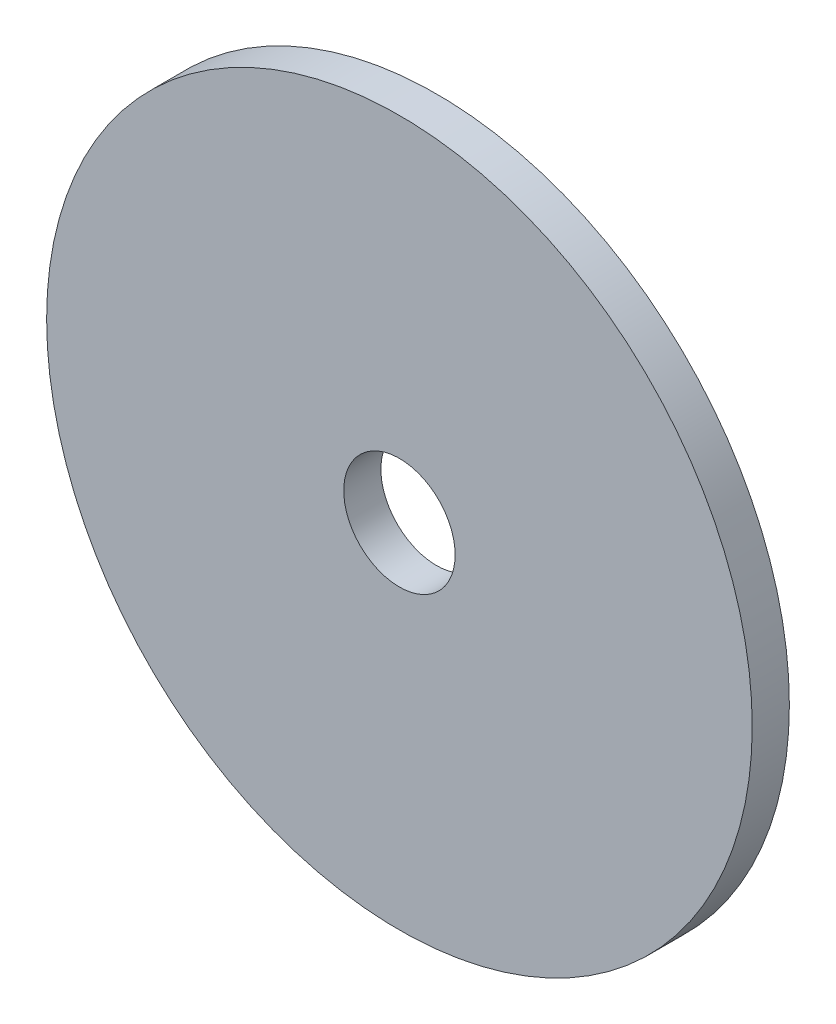
ISO-10303-21;
HEADER;
FILE_DESCRIPTION(('STEP AP214'),'2;1');
FILE_NAME('part.step','',(''),(''),'','','');
FILE_SCHEMA(('AUTOMOTIVE_DESIGN { 1 0 10303 214 1 1 1 1 }'));
ENDSEC;
DATA;
#1=APPLICATION_CONTEXT('core data for automotive mechanical design processes');
#2=APPLICATION_PROTOCOL_DEFINITION('international standard','automotive_design',2000,#1);
#3=PRODUCT_CONTEXT('',#1,'mechanical');
#4=PRODUCT('Part','Part','',(#3));
#5=PRODUCT_RELATED_PRODUCT_CATEGORY('part','',(#4));
#6=PRODUCT_DEFINITION_FORMATION('','',#4);
#7=PRODUCT_DEFINITION_CONTEXT('part definition',#1,'design');
#8=PRODUCT_DEFINITION('design','',#6,#7);
#9=PRODUCT_DEFINITION_SHAPE('','',#8);
#10=(LENGTH_UNIT() NAMED_UNIT(*) SI_UNIT(.MILLI.,.METRE.));
#11=(NAMED_UNIT(*) PLANE_ANGLE_UNIT() SI_UNIT($,.RADIAN.));
#12=(NAMED_UNIT(*) SI_UNIT($,.STERADIAN.) SOLID_ANGLE_UNIT());
#13=UNCERTAINTY_MEASURE_WITH_UNIT(LENGTH_MEASURE(1.E-05),#10,'distance_accuracy_value','');
#14=(GEOMETRIC_REPRESENTATION_CONTEXT(3) GLOBAL_UNCERTAINTY_ASSIGNED_CONTEXT((#13)) GLOBAL_UNIT_ASSIGNED_CONTEXT((#10,
#11,#12)) REPRESENTATION_CONTEXT('',''));
#15=CARTESIAN_POINT('',(0.,0.,0.));
#16=DIRECTION('',(0.,0.,1.));
#17=DIRECTION('',(1.,0.,0.));
#18=AXIS2_PLACEMENT_3D('',#15,#16,#17);
#19=CARTESIAN_POINT('',(0.,0.,1.));
#20=DIRECTION('',(0.,0.,-1.));
#21=DIRECTION('',(-1.,0.,0.));
#22=AXIS2_PLACEMENT_3D('',#19,#20,#21);
#23=CYLINDRICAL_SURFACE('',#22,9.5);
#24=CARTESIAN_POINT('',(0.,0.,1.));
#25=DIRECTION('',(0.,0.,1.));
#26=DIRECTION('',(1.,0.,0.));
#27=AXIS2_PLACEMENT_3D('',#24,#25,#26);
#28=CIRCLE('',#27,9.5);
#29=CARTESIAN_POINT('',(9.5,0.,1.));
#30=VERTEX_POINT('',#29);
#31=EDGE_CURVE('E10',#30,#30,#28,.T.);
#32=ORIENTED_EDGE('',*,*,#31,.F.);
#33=EDGE_LOOP('',(#32));
#34=FACE_BOUND('',#33,.T.);
#35=CARTESIAN_POINT('',(0.,0.,0.));
#36=DIRECTION('',(0.,0.,1.));
#37=DIRECTION('',(1.,0.,0.));
#38=AXIS2_PLACEMENT_3D('',#35,#36,#37);
#39=CIRCLE('',#38,9.5);
#40=CARTESIAN_POINT('',(9.5,0.,0.));
#41=VERTEX_POINT('',#40);
#42=EDGE_CURVE('E33',#41,#41,#39,.T.);
#43=ORIENTED_EDGE('',*,*,#42,.T.);
#44=EDGE_LOOP('',(#43));
#45=FACE_BOUND('',#44,.T.);
#46=ADVANCED_FACE('F30',(#34,#45),#23,.T.);
#47=CARTESIAN_POINT('',(0.,0.,1.));
#48=DIRECTION('',(0.,0.,1.));
#49=DIRECTION('',(1.,0.,0.));
#50=AXIS2_PLACEMENT_3D('',#47,#48,#49);
#51=PLANE('',#50);
#52=CARTESIAN_POINT('',(0.,0.,1.));
#53=DIRECTION('',(0.,0.,1.));
#54=DIRECTION('',(1.,0.,0.));
#55=AXIS2_PLACEMENT_3D('',#52,#53,#54);
#56=CIRCLE('',#55,1.5);
#57=CARTESIAN_POINT('',(1.5,0.,1.));
#58=VERTEX_POINT('',#57);
#59=EDGE_CURVE('E42',#58,#58,#56,.T.);
#60=ORIENTED_EDGE('',*,*,#59,.F.);
#61=EDGE_LOOP('',(#60));
#62=FACE_BOUND('',#61,.T.);
#63=ORIENTED_EDGE('',*,*,#31,.T.);
#64=EDGE_LOOP('',(#63));
#65=FACE_BOUND('',#64,.T.);
#66=ADVANCED_FACE('F57',(#62,#65),#51,.T.);
#67=CARTESIAN_POINT('',(0.,0.,0.));
#68=DIRECTION('',(0.,0.,1.));
#69=DIRECTION('',(1.,0.,0.));
#70=AXIS2_PLACEMENT_3D('',#67,#68,#69);
#71=PLANE('',#70);
#72=CARTESIAN_POINT('',(0.,0.,0.));
#73=DIRECTION('',(0.,0.,1.));
#74=DIRECTION('',(1.,0.,0.));
#75=AXIS2_PLACEMENT_3D('',#72,#73,#74);
#76=CIRCLE('',#75,1.5);
#77=CARTESIAN_POINT('',(1.5,0.,0.));
#78=VERTEX_POINT('',#77);
#79=EDGE_CURVE('E40',#78,#78,#76,.T.);
#80=ORIENTED_EDGE('',*,*,#79,.T.);
#81=EDGE_LOOP('',(#80));
#82=FACE_BOUND('',#81,.T.);
#83=ORIENTED_EDGE('',*,*,#42,.F.);
#84=EDGE_LOOP('',(#83));
#85=FACE_BOUND('',#84,.T.);
#86=ADVANCED_FACE('F48',(#82,#85),#71,.F.);
#87=CARTESIAN_POINT('',(0.,0.,0.));
#88=DIRECTION('',(0.,0.,1.));
#89=DIRECTION('',(1.,0.,0.));
#90=AXIS2_PLACEMENT_3D('',#87,#88,#89);
#91=CYLINDRICAL_SURFACE('',#90,1.5);
#92=ORIENTED_EDGE('',*,*,#79,.F.);
#93=EDGE_LOOP('',(#92));
#94=FACE_BOUND('',#93,.T.);
#95=ORIENTED_EDGE('',*,*,#59,.T.);
#96=EDGE_LOOP('',(#95));
#97=FACE_BOUND('',#96,.T.);
#98=ADVANCED_FACE('F51',(#94,#97),#91,.F.);
#99=CLOSED_SHELL('',(#46,#66,#86,#98));
#100=MANIFOLD_SOLID_BREP('B2',#99);
#101=ADVANCED_BREP_SHAPE_REPRESENTATION('',(#18,#100),#14);
#102=SHAPE_DEFINITION_REPRESENTATION(#9,#101);
ENDSEC;
END-ISO-10303-21;
